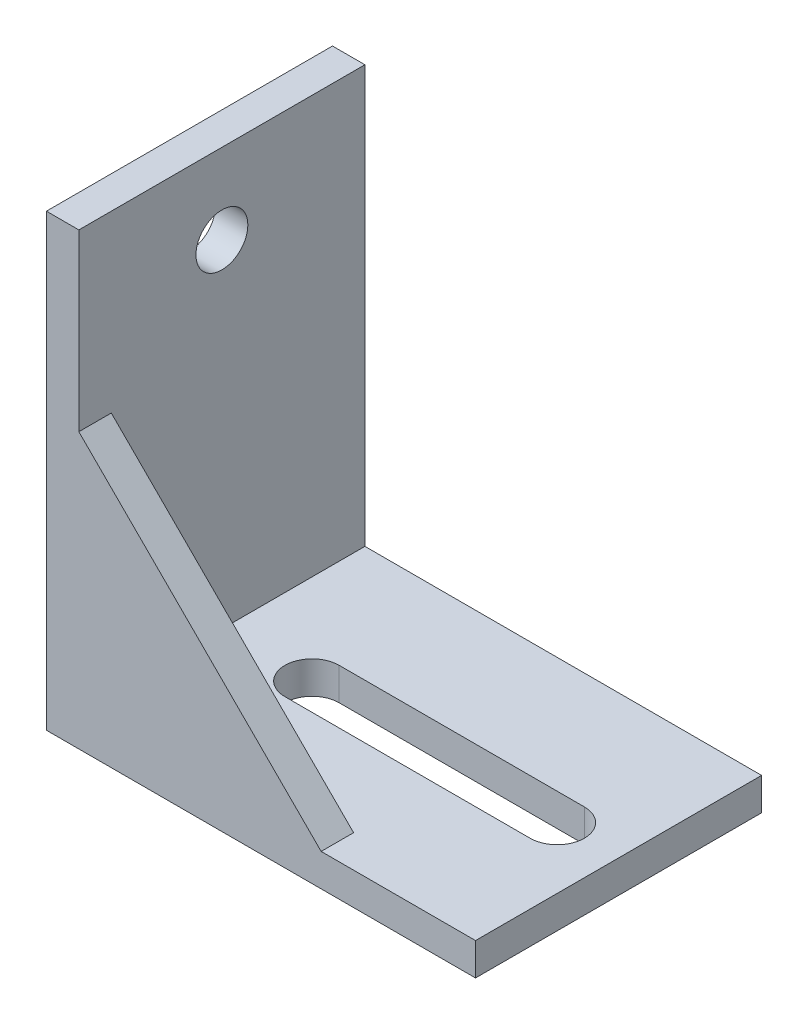
ISO-10303-21;
HEADER;
FILE_DESCRIPTION(('STEP AP214'),'2;1');
FILE_NAME('part.step','',(''),(''),'','','');
FILE_SCHEMA(('AUTOMOTIVE_DESIGN { 1 0 10303 214 1 1 1 1 }'));
ENDSEC;
DATA;
#1=APPLICATION_CONTEXT('core data for automotive mechanical design processes');
#2=APPLICATION_PROTOCOL_DEFINITION('international standard','automotive_design',2000,#1);
#3=PRODUCT_CONTEXT('',#1,'mechanical');
#4=PRODUCT('Part','Part','',(#3));
#5=PRODUCT_RELATED_PRODUCT_CATEGORY('part','',(#4));
#6=PRODUCT_DEFINITION_FORMATION('','',#4);
#7=PRODUCT_DEFINITION_CONTEXT('part definition',#1,'design');
#8=PRODUCT_DEFINITION('design','',#6,#7);
#9=PRODUCT_DEFINITION_SHAPE('','',#8);
#10=(LENGTH_UNIT() NAMED_UNIT(*) SI_UNIT(.MILLI.,.METRE.));
#11=(NAMED_UNIT(*) PLANE_ANGLE_UNIT() SI_UNIT($,.RADIAN.));
#12=(NAMED_UNIT(*) SI_UNIT($,.STERADIAN.) SOLID_ANGLE_UNIT());
#13=UNCERTAINTY_MEASURE_WITH_UNIT(LENGTH_MEASURE(1.E-05),#10,'distance_accuracy_value','');
#14=(GEOMETRIC_REPRESENTATION_CONTEXT(3) GLOBAL_UNCERTAINTY_ASSIGNED_CONTEXT((#13)) GLOBAL_UNIT_ASSIGNED_CONTEXT((#10,
#11,#12)) REPRESENTATION_CONTEXT('',''));
#15=CARTESIAN_POINT('',(0.,0.,0.));
#16=DIRECTION('',(0.,0.,1.));
#17=DIRECTION('',(1.,0.,0.));
#18=AXIS2_PLACEMENT_3D('',#15,#16,#17);
#19=CARTESIAN_POINT('',(7.9375,0.,0.));
#20=DIRECTION('',(1.,0.,0.));
#21=DIRECTION('',(0.,0.,-1.));
#22=AXIS2_PLACEMENT_3D('',#19,#20,#21);
#23=PLANE('',#22);
#24=CARTESIAN_POINT('',(7.9375,60.3787408271621,0.));
#25=DIRECTION('',(1.,0.,0.));
#26=DIRECTION('',(0.,0.,-1.));
#27=AXIS2_PLACEMENT_3D('',#24,#25,#26);
#28=CIRCLE('',#27,6.35);
#29=CARTESIAN_POINT('',(7.9375,60.3787408271621,-6.35));
#30=VERTEX_POINT('',#29);
#31=EDGE_CURVE('E192',#30,#30,#28,.T.);
#32=ORIENTED_EDGE('',*,*,#31,.F.);
#33=EDGE_LOOP('',(#32));
#34=FACE_BOUND('',#33,.T.);
#35=DIRECTION('',(0.,-1.,0.));
#36=VECTOR('',#35,1.);
#37=CARTESIAN_POINT('',(7.9375,0.,35.));
#38=LINE('',#37,#36);
#39=CARTESIAN_POINT('',(7.9375,80.,35.));
#40=VERTEX_POINT('',#39);
#41=CARTESIAN_POINT('',(7.9375,37.2289289259256,35.));
#42=VERTEX_POINT('',#41);
#43=EDGE_CURVE('E55',#40,#42,#38,.T.);
#44=ORIENTED_EDGE('',*,*,#43,.T.);
#45=DIRECTION('',(0.,0.,-1.));
#46=VECTOR('',#45,1.);
#47=CARTESIAN_POINT('',(7.9375,37.2289289259256,0.));
#48=LINE('',#47,#46);
#49=CARTESIAN_POINT('',(7.9375,37.2289289259256,27.0625));
#50=VERTEX_POINT('',#49);
#51=EDGE_CURVE('E50',#42,#50,#48,.T.);
#52=ORIENTED_EDGE('',*,*,#51,.T.);
#53=DIRECTION('',(0.,-1.,0.));
#54=VECTOR('',#53,1.);
#55=CARTESIAN_POINT('',(7.9375,0.,27.0625));
#56=LINE('',#55,#54);
#57=CARTESIAN_POINT('',(7.9375,-22.0625,27.0625));
#58=VERTEX_POINT('',#57);
#59=EDGE_CURVE('E145',#50,#58,#56,.T.);
#60=ORIENTED_EDGE('',*,*,#59,.T.);
#61=DIRECTION('',(0.,0.,1.));
#62=VECTOR('',#61,1.);
#63=CARTESIAN_POINT('',(7.9375,-22.0625,0.));
#64=LINE('',#63,#62);
#65=CARTESIAN_POINT('',(7.9375,-22.0625,-35.));
#66=VERTEX_POINT('',#65);
#67=EDGE_CURVE('E133',#66,#58,#64,.T.);
#68=ORIENTED_EDGE('',*,*,#67,.F.);
#69=DIRECTION('',(0.,-1.,0.));
#70=VECTOR('',#69,1.);
#71=CARTESIAN_POINT('',(7.9375,0.,-35.));
#72=LINE('',#71,#70);
#73=CARTESIAN_POINT('',(7.9375,80.,-35.));
#74=VERTEX_POINT('',#73);
#75=EDGE_CURVE('E195',#74,#66,#72,.T.);
#76=ORIENTED_EDGE('',*,*,#75,.F.);
#77=DIRECTION('',(0.,0.,-1.));
#78=VECTOR('',#77,1.);
#79=CARTESIAN_POINT('',(7.9375,80.,0.));
#80=LINE('',#79,#78);
#81=EDGE_CURVE('E199',#40,#74,#80,.T.);
#82=ORIENTED_EDGE('',*,*,#81,.F.);
#83=EDGE_LOOP('',(#44,#52,#60,#68,#76,#82));
#84=FACE_BOUND('',#83,.T.);
#85=ADVANCED_FACE('F35',(#34,#84),#23,.T.);
#86=CARTESIAN_POINT('',(0.,-22.0625,0.));
#87=DIRECTION('',(0.,-1.,0.));
#88=DIRECTION('',(0.,0.,-1.));
#89=AXIS2_PLACEMENT_3D('',#86,#87,#88);
#90=PLANE('',#89);
#91=CARTESIAN_POINT('',(90.,-22.0625,0.));
#92=DIRECTION('',(0.,-1.,0.));
#93=DIRECTION('',(0.,0.,-1.));
#94=AXIS2_PLACEMENT_3D('',#91,#92,#93);
#95=CIRCLE('',#94,6.64034916170633);
#96=CARTESIAN_POINT('',(90.,-22.0625,-6.64034916170633));
#97=VERTEX_POINT('',#96);
#98=CARTESIAN_POINT('',(90.,-22.0625,6.64034916170633));
#99=VERTEX_POINT('',#98);
#100=EDGE_CURVE('E151',#97,#99,#95,.T.);
#101=ORIENTED_EDGE('',*,*,#100,.T.);
#102=DIRECTION('',(1.,0.,0.));
#103=VECTOR('',#102,1.);
#104=CARTESIAN_POINT('',(0.,-22.0625,6.64034916170633));
#105=LINE('',#104,#103);
#106=CARTESIAN_POINT('',(30.,-22.0625,6.64034916170633));
#107=VERTEX_POINT('',#106);
#108=EDGE_CURVE('E158',#107,#99,#105,.T.);
#109=ORIENTED_EDGE('',*,*,#108,.F.);
#110=CARTESIAN_POINT('',(30.,-22.0625,0.));
#111=DIRECTION('',(0.,-1.,0.));
#112=DIRECTION('',(0.,0.,-1.));
#113=AXIS2_PLACEMENT_3D('',#110,#111,#112);
#114=CIRCLE('',#113,6.64034916170633);
#115=CARTESIAN_POINT('',(30.,-22.0625,-6.64034916170633));
#116=VERTEX_POINT('',#115);
#117=EDGE_CURVE('E156',#107,#116,#114,.T.);
#118=ORIENTED_EDGE('',*,*,#117,.T.);
#119=DIRECTION('',(1.,0.,0.));
#120=VECTOR('',#119,1.);
#121=CARTESIAN_POINT('',(0.,-22.0625,-6.64034916170633));
#122=LINE('',#121,#120);
#123=EDGE_CURVE('E153',#116,#97,#122,.T.);
#124=ORIENTED_EDGE('',*,*,#123,.T.);
#125=EDGE_LOOP('',(#101,#109,#118,#124));
#126=FACE_BOUND('',#125,.T.);
#127=DIRECTION('',(0.,0.,-1.));
#128=VECTOR('',#127,1.);
#129=CARTESIAN_POINT('',(67.2289289259262,-22.0625,0.));
#130=LINE('',#129,#128);
#131=CARTESIAN_POINT('',(67.2289289259262,-22.0625,35.));
#132=VERTEX_POINT('',#131);
#133=CARTESIAN_POINT('',(67.2289289259262,-22.0625,27.0625));
#134=VERTEX_POINT('',#133);
#135=EDGE_CURVE('E11',#132,#134,#130,.T.);
#136=ORIENTED_EDGE('',*,*,#135,.F.);
#137=DIRECTION('',(1.,0.,0.));
#138=VECTOR('',#137,1.);
#139=CARTESIAN_POINT('',(0.,-22.0625,35.));
#140=LINE('',#139,#138);
#141=CARTESIAN_POINT('',(105.,-22.0625,35.));
#142=VERTEX_POINT('',#141);
#143=EDGE_CURVE('E123',#132,#142,#140,.T.);
#144=ORIENTED_EDGE('',*,*,#143,.T.);
#145=DIRECTION('',(0.,0.,-1.));
#146=VECTOR('',#145,1.);
#147=CARTESIAN_POINT('',(105.,-22.0625,0.));
#148=LINE('',#147,#146);
#149=CARTESIAN_POINT('',(105.,-22.0625,-35.));
#150=VERTEX_POINT('',#149);
#151=EDGE_CURVE('E134',#142,#150,#148,.T.);
#152=ORIENTED_EDGE('',*,*,#151,.T.);
#153=DIRECTION('',(1.,0.,0.));
#154=VECTOR('',#153,1.);
#155=CARTESIAN_POINT('',(0.,-22.0625,-35.));
#156=LINE('',#155,#154);
#157=EDGE_CURVE('E163',#66,#150,#156,.T.);
#158=ORIENTED_EDGE('',*,*,#157,.F.);
#159=ORIENTED_EDGE('',*,*,#67,.T.);
#160=DIRECTION('',(-1.,0.,0.));
#161=VECTOR('',#160,1.);
#162=CARTESIAN_POINT('',(0.,-22.0625,27.0625));
#163=LINE('',#162,#161);
#164=EDGE_CURVE('E43',#134,#58,#163,.T.);
#165=ORIENTED_EDGE('',*,*,#164,.F.);
#166=EDGE_LOOP('',(#136,#144,#152,#158,#159,#165));
#167=FACE_BOUND('',#166,.T.);
#168=ADVANCED_FACE('F136',(#126,#167),#90,.F.);
#169=CARTESIAN_POINT('',(7.9375,0.,-35.));
#170=DIRECTION('',(0.,0.,-1.));
#171=DIRECTION('',(-1.,0.,0.));
#172=AXIS2_PLACEMENT_3D('',#169,#170,#171);
#173=PLANE('',#172);
#174=DIRECTION('',(0.,-1.,0.));
#175=VECTOR('',#174,1.);
#176=CARTESIAN_POINT('',(0.,0.,-35.));
#177=LINE('',#176,#175);
#178=CARTESIAN_POINT('',(0.,80.,-35.));
#179=VERTEX_POINT('',#178);
#180=CARTESIAN_POINT('',(0.,-30.,-35.));
#181=VERTEX_POINT('',#180);
#182=EDGE_CURVE('E206',#179,#181,#177,.T.);
#183=ORIENTED_EDGE('',*,*,#182,.F.);
#184=DIRECTION('',(-1.,0.,0.));
#185=VECTOR('',#184,1.);
#186=CARTESIAN_POINT('',(7.9375,80.,-35.));
#187=LINE('',#186,#185);
#188=EDGE_CURVE('E221',#74,#179,#187,.T.);
#189=ORIENTED_EDGE('',*,*,#188,.F.);
#190=ORIENTED_EDGE('',*,*,#75,.T.);
#191=ORIENTED_EDGE('',*,*,#157,.T.);
#192=DIRECTION('',(0.,-1.,0.));
#193=VECTOR('',#192,1.);
#194=CARTESIAN_POINT('',(105.,-22.0625,-35.));
#195=LINE('',#194,#193);
#196=CARTESIAN_POINT('',(105.,-30.,-35.));
#197=VERTEX_POINT('',#196);
#198=EDGE_CURVE('E178',#150,#197,#195,.T.);
#199=ORIENTED_EDGE('',*,*,#198,.T.);
#200=DIRECTION('',(-1.,0.,0.));
#201=VECTOR('',#200,1.);
#202=CARTESIAN_POINT('',(7.9375,-30.,-35.));
#203=LINE('',#202,#201);
#204=EDGE_CURVE('E203',#197,#181,#203,.T.);
#205=ORIENTED_EDGE('',*,*,#204,.T.);
#206=EDGE_LOOP('',(#183,#189,#190,#191,#199,#205));
#207=FACE_BOUND('',#206,.T.);
#208=ADVANCED_FACE('F229',(#207),#173,.T.);
#209=CARTESIAN_POINT('',(7.9375,80.,0.));
#210=DIRECTION('',(0.,1.,0.));
#211=DIRECTION('',(0.,0.,1.));
#212=AXIS2_PLACEMENT_3D('',#209,#210,#211);
#213=PLANE('',#212);
#214=DIRECTION('',(0.,0.,-1.));
#215=VECTOR('',#214,1.);
#216=CARTESIAN_POINT('',(0.,80.,0.));
#217=LINE('',#216,#215);
#218=CARTESIAN_POINT('',(0.,80.,35.));
#219=VERTEX_POINT('',#218);
#220=EDGE_CURVE('E209',#219,#179,#217,.T.);
#221=ORIENTED_EDGE('',*,*,#220,.F.);
#222=DIRECTION('',(-1.,0.,0.));
#223=VECTOR('',#222,1.);
#224=CARTESIAN_POINT('',(7.9375,80.,35.));
#225=LINE('',#224,#223);
#226=EDGE_CURVE('E219',#40,#219,#225,.T.);
#227=ORIENTED_EDGE('',*,*,#226,.F.);
#228=ORIENTED_EDGE('',*,*,#81,.T.);
#229=ORIENTED_EDGE('',*,*,#188,.T.);
#230=EDGE_LOOP('',(#221,#227,#228,#229));
#231=FACE_BOUND('',#230,.T.);
#232=ADVANCED_FACE('F232',(#231),#213,.T.);
#233=CARTESIAN_POINT('',(7.9375,0.,35.));
#234=DIRECTION('',(0.,0.,-1.));
#235=DIRECTION('',(-1.,0.,0.));
#236=AXIS2_PLACEMENT_3D('',#233,#234,#235);
#237=PLANE('',#236);
#238=DIRECTION('',(0.,-1.,0.));
#239=VECTOR('',#238,1.);
#240=CARTESIAN_POINT('',(0.,0.,35.));
#241=LINE('',#240,#239);
#242=CARTESIAN_POINT('',(0.,-30.,35.));
#243=VERTEX_POINT('',#242);
#244=EDGE_CURVE('E212',#219,#243,#241,.T.);
#245=ORIENTED_EDGE('',*,*,#244,.T.);
#246=DIRECTION('',(-1.,0.,0.));
#247=VECTOR('',#246,1.);
#248=CARTESIAN_POINT('',(7.9375,-30.,35.));
#249=LINE('',#248,#247);
#250=CARTESIAN_POINT('',(105.,-30.,35.));
#251=VERTEX_POINT('',#250);
#252=EDGE_CURVE('E217',#251,#243,#249,.T.);
#253=ORIENTED_EDGE('',*,*,#252,.F.);
#254=DIRECTION('',(0.,-1.,0.));
#255=VECTOR('',#254,1.);
#256=CARTESIAN_POINT('',(105.,-22.0625,35.));
#257=LINE('',#256,#255);
#258=EDGE_CURVE('E130',#142,#251,#257,.T.);
#259=ORIENTED_EDGE('',*,*,#258,.F.);
#260=ORIENTED_EDGE('',*,*,#143,.F.);
#261=DIRECTION('',(0.707106781186551,-0.707106781186544,0.));
#262=VECTOR('',#261,1.);
#263=CARTESIAN_POINT('',(0.,45.1664289259255,35.));
#264=LINE('',#263,#262);
#265=EDGE_CURVE('E128',#42,#132,#264,.T.);
#266=ORIENTED_EDGE('',*,*,#265,.F.);
#267=ORIENTED_EDGE('',*,*,#43,.F.);
#268=ORIENTED_EDGE('',*,*,#226,.T.);
#269=EDGE_LOOP('',(#245,#253,#259,#260,#266,#267,#268));
#270=FACE_BOUND('',#269,.T.);
#271=ADVANCED_FACE('F126',(#270),#237,.F.);
#272=CARTESIAN_POINT('',(7.9375,60.3787408271621,0.));
#273=DIRECTION('',(-1.,0.,0.));
#274=DIRECTION('',(0.,0.,1.));
#275=AXIS2_PLACEMENT_3D('',#272,#273,#274);
#276=CYLINDRICAL_SURFACE('',#275,6.35);
#277=ORIENTED_EDGE('',*,*,#31,.T.);
#278=EDGE_LOOP('',(#277));
#279=FACE_BOUND('',#278,.T.);
#280=CARTESIAN_POINT('',(0.,60.3787408271621,0.));
#281=DIRECTION('',(1.,0.,0.));
#282=DIRECTION('',(0.,0.,-1.));
#283=AXIS2_PLACEMENT_3D('',#280,#281,#282);
#284=CIRCLE('',#283,6.35);
#285=CARTESIAN_POINT('',(0.,60.3787408271621,-6.35));
#286=VERTEX_POINT('',#285);
#287=EDGE_CURVE('E181',#286,#286,#284,.T.);
#288=ORIENTED_EDGE('',*,*,#287,.F.);
#289=EDGE_LOOP('',(#288));
#290=FACE_BOUND('',#289,.T.);
#291=ADVANCED_FACE('F37',(#279,#290),#276,.F.);
#292=CARTESIAN_POINT('',(7.9375,-30.,0.));
#293=DIRECTION('',(0.,1.,0.));
#294=DIRECTION('',(0.,0.,1.));
#295=AXIS2_PLACEMENT_3D('',#292,#293,#294);
#296=PLANE('',#295);
#297=ORIENTED_EDGE('',*,*,#252,.T.);
#298=DIRECTION('',(0.,0.,-1.));
#299=VECTOR('',#298,1.);
#300=CARTESIAN_POINT('',(0.,-30.,0.));
#301=LINE('',#300,#299);
#302=EDGE_CURVE('E196',#243,#181,#301,.T.);
#303=ORIENTED_EDGE('',*,*,#302,.T.);
#304=ORIENTED_EDGE('',*,*,#204,.F.);
#305=DIRECTION('',(0.,0.,-1.));
#306=VECTOR('',#305,1.);
#307=CARTESIAN_POINT('',(105.,-30.,0.));
#308=LINE('',#307,#306);
#309=EDGE_CURVE('E154',#251,#197,#308,.T.);
#310=ORIENTED_EDGE('',*,*,#309,.F.);
#311=EDGE_LOOP('',(#297,#303,#304,#310));
#312=FACE_BOUND('',#311,.T.);
#313=CARTESIAN_POINT('',(90.,-30.,0.));
#314=DIRECTION('',(0.,-1.,0.));
#315=DIRECTION('',(0.,0.,-1.));
#316=AXIS2_PLACEMENT_3D('',#313,#314,#315);
#317=CIRCLE('',#316,6.64034916170633);
#318=CARTESIAN_POINT('',(90.,-30.,-6.64034916170633));
#319=VERTEX_POINT('',#318);
#320=CARTESIAN_POINT('',(90.,-30.,6.64034916170633));
#321=VERTEX_POINT('',#320);
#322=EDGE_CURVE('E150',#319,#321,#317,.T.);
#323=ORIENTED_EDGE('',*,*,#322,.F.);
#324=DIRECTION('',(1.,0.,0.));
#325=VECTOR('',#324,1.);
#326=CARTESIAN_POINT('',(0.,-30.,-6.64034916170633));
#327=LINE('',#326,#325);
#328=CARTESIAN_POINT('',(30.,-30.,-6.64034916170633));
#329=VERTEX_POINT('',#328);
#330=EDGE_CURVE('E169',#329,#319,#327,.T.);
#331=ORIENTED_EDGE('',*,*,#330,.F.);
#332=CARTESIAN_POINT('',(30.,-30.,0.));
#333=DIRECTION('',(0.,-1.,0.));
#334=DIRECTION('',(0.,0.,-1.));
#335=AXIS2_PLACEMENT_3D('',#332,#333,#334);
#336=CIRCLE('',#335,6.64034916170633);
#337=CARTESIAN_POINT('',(30.,-30.,6.64034916170633));
#338=VERTEX_POINT('',#337);
#339=EDGE_CURVE('E171',#338,#329,#336,.T.);
#340=ORIENTED_EDGE('',*,*,#339,.F.);
#341=DIRECTION('',(1.,0.,0.));
#342=VECTOR('',#341,1.);
#343=CARTESIAN_POINT('',(0.,-30.,6.64034916170633));
#344=LINE('',#343,#342);
#345=EDGE_CURVE('E173',#338,#321,#344,.T.);
#346=ORIENTED_EDGE('',*,*,#345,.T.);
#347=EDGE_LOOP('',(#323,#331,#340,#346));
#348=FACE_BOUND('',#347,.T.);
#349=ADVANCED_FACE('F239',(#312,#348),#296,.F.);
#350=CARTESIAN_POINT('',(0.,0.,0.));
#351=DIRECTION('',(1.,0.,0.));
#352=DIRECTION('',(0.,0.,-1.));
#353=AXIS2_PLACEMENT_3D('',#350,#351,#352);
#354=PLANE('',#353);
#355=ORIENTED_EDGE('',*,*,#302,.F.);
#356=ORIENTED_EDGE('',*,*,#244,.F.);
#357=ORIENTED_EDGE('',*,*,#220,.T.);
#358=ORIENTED_EDGE('',*,*,#182,.T.);
#359=EDGE_LOOP('',(#355,#356,#357,#358));
#360=FACE_BOUND('',#359,.T.);
#361=ORIENTED_EDGE('',*,*,#287,.T.);
#362=EDGE_LOOP('',(#361));
#363=FACE_BOUND('',#362,.T.);
#364=ADVANCED_FACE('F236',(#360,#363),#354,.F.);
#365=CARTESIAN_POINT('',(105.,-22.0625,0.));
#366=DIRECTION('',(-1.,0.,0.));
#367=DIRECTION('',(0.,0.,1.));
#368=AXIS2_PLACEMENT_3D('',#365,#366,#367);
#369=PLANE('',#368);
#370=ORIENTED_EDGE('',*,*,#309,.T.);
#371=ORIENTED_EDGE('',*,*,#198,.F.);
#372=ORIENTED_EDGE('',*,*,#151,.F.);
#373=ORIENTED_EDGE('',*,*,#258,.T.);
#374=EDGE_LOOP('',(#370,#371,#372,#373));
#375=FACE_BOUND('',#374,.T.);
#376=ADVANCED_FACE('F243',(#375),#369,.F.);
#377=CARTESIAN_POINT('',(90.,-22.0625,0.));
#378=DIRECTION('',(0.,-1.,0.));
#379=DIRECTION('',(0.,0.,-1.));
#380=AXIS2_PLACEMENT_3D('',#377,#378,#379);
#381=CYLINDRICAL_SURFACE('',#380,6.64034916170633);
#382=ORIENTED_EDGE('',*,*,#322,.T.);
#383=DIRECTION('',(0.,-1.,0.));
#384=VECTOR('',#383,1.);
#385=CARTESIAN_POINT('',(90.,-22.0625,6.64034916170633));
#386=LINE('',#385,#384);
#387=EDGE_CURVE('E183',#99,#321,#386,.T.);
#388=ORIENTED_EDGE('',*,*,#387,.F.);
#389=ORIENTED_EDGE('',*,*,#100,.F.);
#390=DIRECTION('',(0.,-1.,0.));
#391=VECTOR('',#390,1.);
#392=CARTESIAN_POINT('',(90.,-22.0625,-6.64034916170633));
#393=LINE('',#392,#391);
#394=EDGE_CURVE('E166',#97,#319,#393,.T.);
#395=ORIENTED_EDGE('',*,*,#394,.T.);
#396=EDGE_LOOP('',(#382,#388,#389,#395));
#397=FACE_BOUND('',#396,.T.);
#398=ADVANCED_FACE('F245',(#397),#381,.F.);
#399=CARTESIAN_POINT('',(0.,-22.0625,6.64034916170633));
#400=DIRECTION('',(0.,0.,-1.));
#401=DIRECTION('',(-1.,0.,0.));
#402=AXIS2_PLACEMENT_3D('',#399,#400,#401);
#403=PLANE('',#402);
#404=ORIENTED_EDGE('',*,*,#345,.F.);
#405=DIRECTION('',(0.,-1.,0.));
#406=VECTOR('',#405,1.);
#407=CARTESIAN_POINT('',(30.,-22.0625,6.64034916170633));
#408=LINE('',#407,#406);
#409=EDGE_CURVE('E185',#107,#338,#408,.T.);
#410=ORIENTED_EDGE('',*,*,#409,.F.);
#411=ORIENTED_EDGE('',*,*,#108,.T.);
#412=ORIENTED_EDGE('',*,*,#387,.T.);
#413=EDGE_LOOP('',(#404,#410,#411,#412));
#414=FACE_BOUND('',#413,.T.);
#415=ADVANCED_FACE('F251',(#414),#403,.T.);
#416=CARTESIAN_POINT('',(30.,-22.0625,0.));
#417=DIRECTION('',(0.,-1.,0.));
#418=DIRECTION('',(0.,0.,-1.));
#419=AXIS2_PLACEMENT_3D('',#416,#417,#418);
#420=CYLINDRICAL_SURFACE('',#419,6.64034916170633);
#421=ORIENTED_EDGE('',*,*,#339,.T.);
#422=DIRECTION('',(0.,-1.,0.));
#423=VECTOR('',#422,1.);
#424=CARTESIAN_POINT('',(30.,-22.0625,-6.64034916170633));
#425=LINE('',#424,#423);
#426=EDGE_CURVE('E187',#116,#329,#425,.T.);
#427=ORIENTED_EDGE('',*,*,#426,.F.);
#428=ORIENTED_EDGE('',*,*,#117,.F.);
#429=ORIENTED_EDGE('',*,*,#409,.T.);
#430=EDGE_LOOP('',(#421,#427,#428,#429));
#431=FACE_BOUND('',#430,.T.);
#432=ADVANCED_FACE('F325',(#431),#420,.F.);
#433=CARTESIAN_POINT('',(0.,-22.0625,-6.64034916170633));
#434=DIRECTION('',(0.,0.,-1.));
#435=DIRECTION('',(-1.,0.,0.));
#436=AXIS2_PLACEMENT_3D('',#433,#434,#435);
#437=PLANE('',#436);
#438=ORIENTED_EDGE('',*,*,#330,.T.);
#439=ORIENTED_EDGE('',*,*,#394,.F.);
#440=ORIENTED_EDGE('',*,*,#123,.F.);
#441=ORIENTED_EDGE('',*,*,#426,.T.);
#442=EDGE_LOOP('',(#438,#439,#440,#441));
#443=FACE_BOUND('',#442,.T.);
#444=ADVANCED_FACE('F309',(#443),#437,.F.);
#445=CARTESIAN_POINT('',(0.,45.1664289259255,27.0625));
#446=DIRECTION('',(-0.707106781186544,-0.707106781186551,0.));
#447=DIRECTION('',(0.707106781186551,-0.707106781186544,0.));
#448=AXIS2_PLACEMENT_3D('',#445,#446,#447);
#449=PLANE('',#448);
#450=ORIENTED_EDGE('',*,*,#51,.F.);
#451=ORIENTED_EDGE('',*,*,#265,.T.);
#452=ORIENTED_EDGE('',*,*,#135,.T.);
#453=DIRECTION('',(0.707106781186551,-0.707106781186544,0.));
#454=VECTOR('',#453,1.);
#455=CARTESIAN_POINT('',(0.,45.1664289259255,27.0625));
#456=LINE('',#455,#454);
#457=EDGE_CURVE('E143',#50,#134,#456,.T.);
#458=ORIENTED_EDGE('',*,*,#457,.F.);
#459=EDGE_LOOP('',(#450,#451,#452,#458));
#460=FACE_BOUND('',#459,.T.);
#461=ADVANCED_FACE('F142',(#460),#449,.F.);
#462=CARTESIAN_POINT('',(0.,0.,27.0625));
#463=DIRECTION('',(0.,0.,1.));
#464=DIRECTION('',(1.,0.,0.));
#465=AXIS2_PLACEMENT_3D('',#462,#463,#464);
#466=PLANE('',#465);
#467=ORIENTED_EDGE('',*,*,#59,.F.);
#468=ORIENTED_EDGE('',*,*,#457,.T.);
#469=ORIENTED_EDGE('',*,*,#164,.T.);
#470=EDGE_LOOP('',(#467,#468,#469));
#471=FACE_BOUND('',#470,.T.);
#472=ADVANCED_FACE('F223',(#471),#466,.F.);
#473=CLOSED_SHELL('',(#85,#168,#208,#232,#271,#291,#349,#364,#376,#398,#415,#432,#444,#461,#472));
#474=MANIFOLD_SOLID_BREP('B2',#473);
#475=ADVANCED_BREP_SHAPE_REPRESENTATION('',(#18,#474),#14);
#476=SHAPE_DEFINITION_REPRESENTATION(#9,#475);
ENDSEC;
END-ISO-10303-21;
